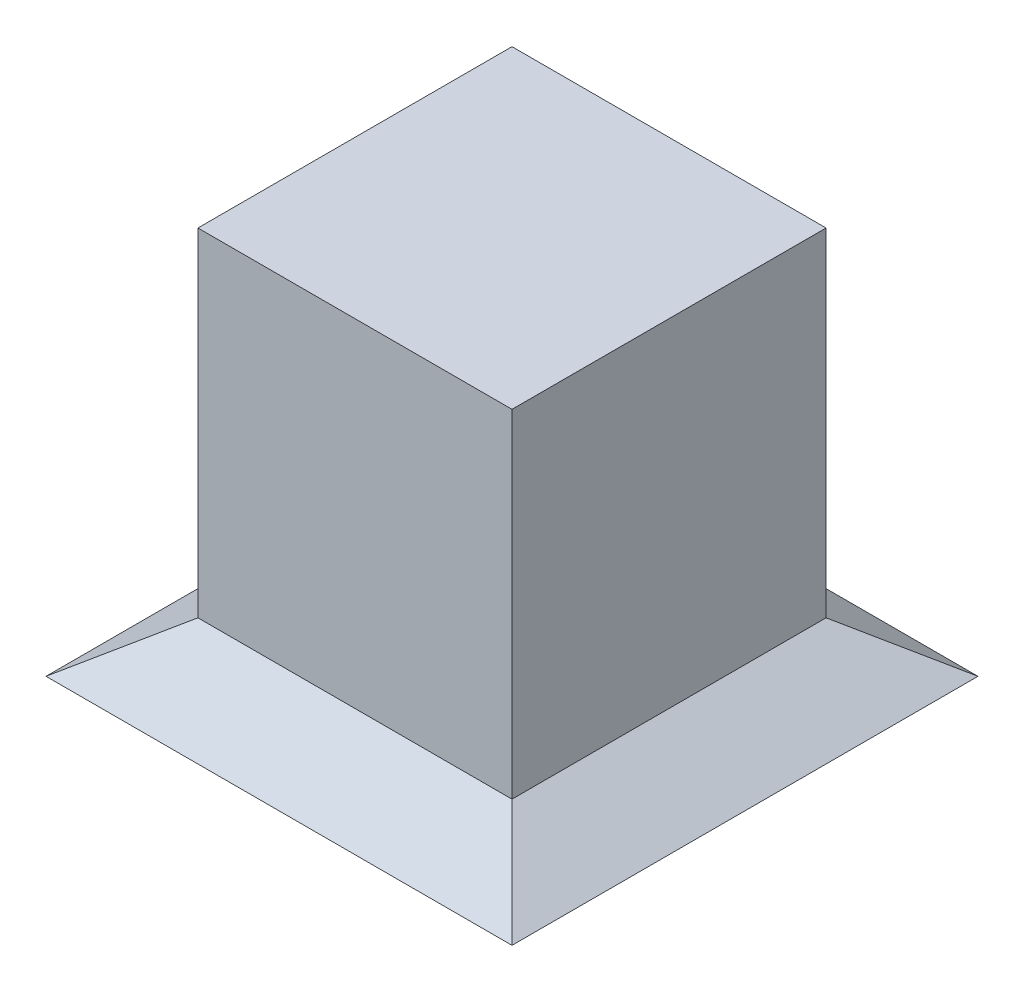
ISO-10303-21;
HEADER;
FILE_DESCRIPTION(('STEP AP214'),'2;1');
FILE_NAME('part.step','',(''),(''),'','','');
FILE_SCHEMA(('AUTOMOTIVE_DESIGN { 1 0 10303 214 1 1 1 1 }'));
ENDSEC;
DATA;
#1=APPLICATION_CONTEXT('core data for automotive mechanical design processes');
#2=APPLICATION_PROTOCOL_DEFINITION('international standard','automotive_design',2000,#1);
#3=PRODUCT_CONTEXT('',#1,'mechanical');
#4=PRODUCT('Part','Part','',(#3));
#5=PRODUCT_RELATED_PRODUCT_CATEGORY('part','',(#4));
#6=PRODUCT_DEFINITION_FORMATION('','',#4);
#7=PRODUCT_DEFINITION_CONTEXT('part definition',#1,'design');
#8=PRODUCT_DEFINITION('design','',#6,#7);
#9=PRODUCT_DEFINITION_SHAPE('','',#8);
#10=(LENGTH_UNIT() NAMED_UNIT(*) SI_UNIT(.MILLI.,.METRE.));
#11=(NAMED_UNIT(*) PLANE_ANGLE_UNIT() SI_UNIT($,.RADIAN.));
#12=(NAMED_UNIT(*) SI_UNIT($,.STERADIAN.) SOLID_ANGLE_UNIT());
#13=UNCERTAINTY_MEASURE_WITH_UNIT(LENGTH_MEASURE(1.E-05),#10,'distance_accuracy_value','');
#14=(GEOMETRIC_REPRESENTATION_CONTEXT(3) GLOBAL_UNCERTAINTY_ASSIGNED_CONTEXT((#13)) GLOBAL_UNIT_ASSIGNED_CONTEXT((#10,
#11,#12)) REPRESENTATION_CONTEXT('',''));
#15=CARTESIAN_POINT('',(0.,0.,0.));
#16=DIRECTION('',(0.,0.,1.));
#17=DIRECTION('',(1.,0.,0.));
#18=AXIS2_PLACEMENT_3D('',#15,#16,#17);
#19=CARTESIAN_POINT('',(0.,0.,0.));
#20=DIRECTION('',(0.,1.,0.));
#21=DIRECTION('',(0.,0.,1.));
#22=AXIS2_PLACEMENT_3D('',#19,#20,#21);
#23=PLANE('',#22);
#24=DIRECTION('',(0.,0.,-1.));
#25=VECTOR('',#24,1.);
#26=CARTESIAN_POINT('',(27.605551275464,0.,0.));
#27=LINE('',#26,#25);
#28=CARTESIAN_POINT('',(27.605551275464,0.,27.605551275464));
#29=VERTEX_POINT('',#28);
#30=CARTESIAN_POINT('',(27.605551275464,0.,-27.605551275464));
#31=VERTEX_POINT('',#30);
#32=EDGE_CURVE('E343',#29,#31,#27,.T.);
#33=ORIENTED_EDGE('',*,*,#32,.F.);
#34=DIRECTION('',(1.,0.,0.));
#35=VECTOR('',#34,1.);
#36=CARTESIAN_POINT('',(0.,0.,27.605551275464));
#37=LINE('',#36,#35);
#38=CARTESIAN_POINT('',(-27.605551275464,0.,27.605551275464));
#39=VERTEX_POINT('',#38);
#40=EDGE_CURVE('E340',#39,#29,#37,.T.);
#41=ORIENTED_EDGE('',*,*,#40,.F.);
#42=DIRECTION('',(0.,0.,1.));
#43=VECTOR('',#42,1.);
#44=CARTESIAN_POINT('',(-27.605551275464,0.,0.));
#45=LINE('',#44,#43);
#46=CARTESIAN_POINT('',(-27.605551275464,0.,-27.605551275464));
#47=VERTEX_POINT('',#46);
#48=EDGE_CURVE('E336',#47,#39,#45,.T.);
#49=ORIENTED_EDGE('',*,*,#48,.F.);
#50=DIRECTION('',(-1.,0.,0.));
#51=VECTOR('',#50,1.);
#52=CARTESIAN_POINT('',(0.,0.,-27.605551275464));
#53=LINE('',#52,#51);
#54=EDGE_CURVE('E339',#31,#47,#53,.T.);
#55=ORIENTED_EDGE('',*,*,#54,.F.);
#56=EDGE_LOOP('',(#33,#41,#49,#55));
#57=FACE_BOUND('',#56,.T.);
#58=DIRECTION('',(0.,0.,-1.));
#59=VECTOR('',#58,1.);
#60=CARTESIAN_POINT('',(24.,0.,-24.));
#61=LINE('',#60,#59);
#62=CARTESIAN_POINT('',(24.,0.,24.));
#63=VERTEX_POINT('',#62);
#64=CARTESIAN_POINT('',(24.,0.,-24.));
#65=VERTEX_POINT('',#64);
#66=EDGE_CURVE('E184',#63,#65,#61,.T.);
#67=ORIENTED_EDGE('',*,*,#66,.T.);
#68=DIRECTION('',(-1.,0.,0.));
#69=VECTOR('',#68,1.);
#70=CARTESIAN_POINT('',(-24.,0.,-24.));
#71=LINE('',#70,#69);
#72=CARTESIAN_POINT('',(-24.,0.,-24.));
#73=VERTEX_POINT('',#72);
#74=EDGE_CURVE('E196',#65,#73,#71,.T.);
#75=ORIENTED_EDGE('',*,*,#74,.T.);
#76=DIRECTION('',(0.,0.,1.));
#77=VECTOR('',#76,1.);
#78=CARTESIAN_POINT('',(-24.,0.,-24.));
#79=LINE('',#78,#77);
#80=CARTESIAN_POINT('',(-24.,0.,24.));
#81=VERTEX_POINT('',#80);
#82=EDGE_CURVE('E85',#73,#81,#79,.T.);
#83=ORIENTED_EDGE('',*,*,#82,.T.);
#84=DIRECTION('',(1.,0.,0.));
#85=VECTOR('',#84,1.);
#86=CARTESIAN_POINT('',(-24.,0.,24.));
#87=LINE('',#86,#85);
#88=EDGE_CURVE('E70',#81,#63,#87,.T.);
#89=ORIENTED_EDGE('',*,*,#88,.T.);
#90=EDGE_LOOP('',(#67,#75,#83,#89));
#91=FACE_BOUND('',#90,.T.);
#92=ADVANCED_FACE('F66',(#57,#91),#23,.F.);
#93=CARTESIAN_POINT('',(0.,12.7410236655988,-8.49401577706585));
#94=DIRECTION('',(0.,-0.832050294337844,0.554700196225229));
#95=DIRECTION('',(0.,-0.554700196225229,-0.832050294337843));
#96=AXIS2_PLACEMENT_3D('',#93,#94,#95);
#97=PLANE('',#96);
#98=DIRECTION('',(0.639602149066831,0.426401432711221,0.639602149066831));
#99=VECTOR('',#98,1.);
#100=CARTESIAN_POINT('',(-5.01919114099346,15.0575734229804,-5.01919114099346));
#101=LINE('',#100,#99);
#102=CARTESIAN_POINT('',(-18.605551275464,6.,-18.605551275464));
#103=VERTEX_POINT('',#102);
#104=EDGE_CURVE('E115',#47,#103,#101,.T.);
#105=ORIENTED_EDGE('',*,*,#104,.T.);
#106=DIRECTION('',(-1.,0.,0.));
#107=VECTOR('',#106,1.);
#108=CARTESIAN_POINT('',(0.,6.,-18.605551275464));
#109=LINE('',#108,#107);
#110=CARTESIAN_POINT('',(18.605551275464,6.,-18.605551275464));
#111=VERTEX_POINT('',#110);
#112=EDGE_CURVE('E12',#111,#103,#109,.T.);
#113=ORIENTED_EDGE('',*,*,#112,.F.);
#114=DIRECTION('',(-0.639602149066832,0.426401432711221,0.639602149066831));
#115=VECTOR('',#114,1.);
#116=CARTESIAN_POINT('',(5.01919114099344,15.0575734229804,-5.01919114099347));
#117=LINE('',#116,#115);
#118=EDGE_CURVE('E95',#31,#111,#117,.T.);
#119=ORIENTED_EDGE('',*,*,#118,.F.);
#120=ORIENTED_EDGE('',*,*,#54,.T.);
#121=EDGE_LOOP('',(#105,#113,#119,#120));
#122=FACE_BOUND('',#121,.T.);
#123=ADVANCED_FACE('F316',(#122),#97,.F.);
#124=CARTESIAN_POINT('',(8.49401577706584,12.7410236655988,0.));
#125=DIRECTION('',(-0.554700196225229,-0.832050294337844,0.));
#126=DIRECTION('',(0.832050294337844,-0.554700196225229,0.));
#127=AXIS2_PLACEMENT_3D('',#124,#125,#126);
#128=PLANE('',#127);
#129=ORIENTED_EDGE('',*,*,#118,.T.);
#130=DIRECTION('',(0.,0.,-1.));
#131=VECTOR('',#130,1.);
#132=CARTESIAN_POINT('',(18.605551275464,6.,0.));
#133=LINE('',#132,#131);
#134=CARTESIAN_POINT('',(18.605551275464,6.,18.605551275464));
#135=VERTEX_POINT('',#134);
#136=EDGE_CURVE('E182',#135,#111,#133,.T.);
#137=ORIENTED_EDGE('',*,*,#136,.F.);
#138=DIRECTION('',(-0.639602149066832,0.426401432711221,-0.639602149066831));
#139=VECTOR('',#138,1.);
#140=CARTESIAN_POINT('',(5.01919114099344,15.0575734229804,5.01919114099347));
#141=LINE('',#140,#139);
#142=EDGE_CURVE('E353',#29,#135,#141,.T.);
#143=ORIENTED_EDGE('',*,*,#142,.F.);
#144=ORIENTED_EDGE('',*,*,#32,.T.);
#145=EDGE_LOOP('',(#129,#137,#143,#144));
#146=FACE_BOUND('',#145,.T.);
#147=ADVANCED_FACE('F485',(#146),#128,.F.);
#148=CARTESIAN_POINT('',(-8.49401577706585,12.7410236655988,0.));
#149=DIRECTION('',(0.554700196225229,-0.832050294337843,0.));
#150=DIRECTION('',(0.832050294337843,0.554700196225229,0.));
#151=AXIS2_PLACEMENT_3D('',#148,#149,#150);
#152=PLANE('',#151);
#153=DIRECTION('',(0.639602149066831,0.426401432711221,-0.639602149066831));
#154=VECTOR('',#153,1.);
#155=CARTESIAN_POINT('',(-5.01919114099346,15.0575734229804,5.01919114099345));
#156=LINE('',#155,#154);
#157=CARTESIAN_POINT('',(-18.605551275464,6.,18.605551275464));
#158=VERTEX_POINT('',#157);
#159=EDGE_CURVE('E349',#39,#158,#156,.T.);
#160=ORIENTED_EDGE('',*,*,#159,.T.);
#161=DIRECTION('',(0.,0.,1.));
#162=VECTOR('',#161,1.);
#163=CARTESIAN_POINT('',(-18.605551275464,6.,0.));
#164=LINE('',#163,#162);
#165=EDGE_CURVE('E77',#103,#158,#164,.T.);
#166=ORIENTED_EDGE('',*,*,#165,.F.);
#167=ORIENTED_EDGE('',*,*,#104,.F.);
#168=ORIENTED_EDGE('',*,*,#48,.T.);
#169=EDGE_LOOP('',(#160,#166,#167,#168));
#170=FACE_BOUND('',#169,.T.);
#171=ADVANCED_FACE('F477',(#170),#152,.F.);
#172=CARTESIAN_POINT('',(0.,12.7410236655988,8.49401577706585));
#173=DIRECTION('',(0.,-0.832050294337844,-0.554700196225229));
#174=DIRECTION('',(0.,0.554700196225229,-0.832050294337843));
#175=AXIS2_PLACEMENT_3D('',#172,#173,#174);
#176=PLANE('',#175);
#177=ORIENTED_EDGE('',*,*,#142,.T.);
#178=DIRECTION('',(1.,0.,0.));
#179=VECTOR('',#178,1.);
#180=CARTESIAN_POINT('',(0.,6.,18.605551275464));
#181=LINE('',#180,#179);
#182=EDGE_CURVE('E360',#158,#135,#181,.T.);
#183=ORIENTED_EDGE('',*,*,#182,.F.);
#184=ORIENTED_EDGE('',*,*,#159,.F.);
#185=ORIENTED_EDGE('',*,*,#40,.T.);
#186=EDGE_LOOP('',(#177,#183,#184,#185));
#187=FACE_BOUND('',#186,.T.);
#188=ADVANCED_FACE('F68',(#187),#176,.F.);
#189=CARTESIAN_POINT('',(0.,4.,0.));
#190=DIRECTION('',(0.,1.,0.));
#191=DIRECTION('',(0.,0.,1.));
#192=AXIS2_PLACEMENT_3D('',#189,#190,#191);
#193=PLANE('',#192);
#194=DIRECTION('',(0.,0.,-1.));
#195=VECTOR('',#194,1.);
#196=CARTESIAN_POINT('',(18.,4.,-18.));
#197=LINE('',#196,#195);
#198=CARTESIAN_POINT('',(18.,4.,18.));
#199=VERTEX_POINT('',#198);
#200=CARTESIAN_POINT('',(18.,4.,-18.));
#201=VERTEX_POINT('',#200);
#202=EDGE_CURVE('E282',#199,#201,#197,.T.);
#203=ORIENTED_EDGE('',*,*,#202,.F.);
#204=DIRECTION('',(1.,0.,0.));
#205=VECTOR('',#204,1.);
#206=CARTESIAN_POINT('',(-18.,4.,18.));
#207=LINE('',#206,#205);
#208=CARTESIAN_POINT('',(-18.,4.,18.));
#209=VERTEX_POINT('',#208);
#210=EDGE_CURVE('E380',#209,#199,#207,.T.);
#211=ORIENTED_EDGE('',*,*,#210,.F.);
#212=DIRECTION('',(0.,0.,1.));
#213=VECTOR('',#212,1.);
#214=CARTESIAN_POINT('',(-18.,4.,-18.));
#215=LINE('',#214,#213);
#216=CARTESIAN_POINT('',(-18.,4.,-18.));
#217=VERTEX_POINT('',#216);
#218=EDGE_CURVE('E231',#217,#209,#215,.T.);
#219=ORIENTED_EDGE('',*,*,#218,.F.);
#220=DIRECTION('',(-1.,0.,0.));
#221=VECTOR('',#220,1.);
#222=CARTESIAN_POINT('',(-18.,4.,-18.));
#223=LINE('',#222,#221);
#224=EDGE_CURVE('E346',#201,#217,#223,.T.);
#225=ORIENTED_EDGE('',*,*,#224,.F.);
#226=EDGE_LOOP('',(#203,#211,#219,#225));
#227=FACE_BOUND('',#226,.T.);
#228=ADVANCED_FACE('F213',(#227),#193,.F.);
#229=CARTESIAN_POINT('',(0.,11.0769230769231,-7.38461538461539));
#230=DIRECTION('',(0.,-0.832050294337844,0.554700196225229));
#231=DIRECTION('',(0.,-0.554700196225229,-0.832050294337843));
#232=AXIS2_PLACEMENT_3D('',#229,#230,#231);
#233=PLANE('',#232);
#234=DIRECTION('',(0.639602149066831,0.426401432711221,0.639602149066831));
#235=VECTOR('',#234,1.);
#236=CARTESIAN_POINT('',(-24.,0.,-24.));
#237=LINE('',#236,#235);
#238=EDGE_CURVE('E426',#73,#217,#237,.T.);
#239=ORIENTED_EDGE('',*,*,#238,.F.);
#240=ORIENTED_EDGE('',*,*,#74,.F.);
#241=DIRECTION('',(-0.639602149066832,0.426401432711221,0.639602149066831));
#242=VECTOR('',#241,1.);
#243=CARTESIAN_POINT('',(24.,0.,-24.));
#244=LINE('',#243,#242);
#245=EDGE_CURVE('E124',#65,#201,#244,.T.);
#246=ORIENTED_EDGE('',*,*,#245,.T.);
#247=ORIENTED_EDGE('',*,*,#224,.T.);
#248=EDGE_LOOP('',(#239,#240,#246,#247));
#249=FACE_BOUND('',#248,.T.);
#250=ADVANCED_FACE('F202',(#249),#233,.T.);
#251=CARTESIAN_POINT('',(7.38461538461538,11.0769230769231,0.));
#252=DIRECTION('',(-0.554700196225229,-0.832050294337844,0.));
#253=DIRECTION('',(0.832050294337844,-0.554700196225229,0.));
#254=AXIS2_PLACEMENT_3D('',#251,#252,#253);
#255=PLANE('',#254);
#256=ORIENTED_EDGE('',*,*,#245,.F.);
#257=ORIENTED_EDGE('',*,*,#66,.F.);
#258=DIRECTION('',(-0.639602149066832,0.426401432711221,-0.639602149066831));
#259=VECTOR('',#258,1.);
#260=CARTESIAN_POINT('',(24.,0.,24.));
#261=LINE('',#260,#259);
#262=EDGE_CURVE('E264',#63,#199,#261,.T.);
#263=ORIENTED_EDGE('',*,*,#262,.T.);
#264=ORIENTED_EDGE('',*,*,#202,.T.);
#265=EDGE_LOOP('',(#256,#257,#263,#264));
#266=FACE_BOUND('',#265,.T.);
#267=ADVANCED_FACE('F212',(#266),#255,.T.);
#268=CARTESIAN_POINT('',(-7.38461538461539,11.0769230769231,0.));
#269=DIRECTION('',(0.554700196225229,-0.832050294337843,0.));
#270=DIRECTION('',(0.832050294337843,0.554700196225229,0.));
#271=AXIS2_PLACEMENT_3D('',#268,#269,#270);
#272=PLANE('',#271);
#273=DIRECTION('',(0.639602149066831,0.426401432711221,-0.639602149066831));
#274=VECTOR('',#273,1.);
#275=CARTESIAN_POINT('',(-24.,0.,24.));
#276=LINE('',#275,#274);
#277=EDGE_CURVE('E255',#81,#209,#276,.T.);
#278=ORIENTED_EDGE('',*,*,#277,.F.);
#279=ORIENTED_EDGE('',*,*,#82,.F.);
#280=ORIENTED_EDGE('',*,*,#238,.T.);
#281=ORIENTED_EDGE('',*,*,#218,.T.);
#282=EDGE_LOOP('',(#278,#279,#280,#281));
#283=FACE_BOUND('',#282,.T.);
#284=ADVANCED_FACE('F237',(#283),#272,.T.);
#285=CARTESIAN_POINT('',(0.,11.0769230769231,7.38461538461539));
#286=DIRECTION('',(0.,-0.832050294337844,-0.554700196225229));
#287=DIRECTION('',(0.,0.554700196225229,-0.832050294337843));
#288=AXIS2_PLACEMENT_3D('',#285,#286,#287);
#289=PLANE('',#288);
#290=ORIENTED_EDGE('',*,*,#262,.F.);
#291=ORIENTED_EDGE('',*,*,#88,.F.);
#292=ORIENTED_EDGE('',*,*,#277,.T.);
#293=ORIENTED_EDGE('',*,*,#210,.T.);
#294=EDGE_LOOP('',(#290,#291,#292,#293));
#295=FACE_BOUND('',#294,.T.);
#296=ADVANCED_FACE('F246',(#295),#289,.T.);
#297=CARTESIAN_POINT('',(18.605551275464,46.,-18.605551275464));
#298=DIRECTION('',(-1.,0.,0.));
#299=DIRECTION('',(0.,0.,1.));
#300=AXIS2_PLACEMENT_3D('',#297,#298,#299);
#301=PLANE('',#300);
#302=ORIENTED_EDGE('',*,*,#136,.T.);
#303=DIRECTION('',(0.,-1.,0.));
#304=VECTOR('',#303,1.);
#305=CARTESIAN_POINT('',(18.605551275464,46.,-18.605551275464));
#306=LINE('',#305,#304);
#307=CARTESIAN_POINT('',(18.605551275464,46.,-18.605551275464));
#308=VERTEX_POINT('',#307);
#309=EDGE_CURVE('E162',#308,#111,#306,.T.);
#310=ORIENTED_EDGE('',*,*,#309,.F.);
#311=DIRECTION('',(0.,0.,-1.));
#312=VECTOR('',#311,1.);
#313=CARTESIAN_POINT('',(18.605551275464,46.,-18.605551275464));
#314=LINE('',#313,#312);
#315=CARTESIAN_POINT('',(18.605551275464,46.,18.605551275464));
#316=VERTEX_POINT('',#315);
#317=EDGE_CURVE('E170',#316,#308,#314,.T.);
#318=ORIENTED_EDGE('',*,*,#317,.F.);
#319=DIRECTION('',(0.,-1.,0.));
#320=VECTOR('',#319,1.);
#321=CARTESIAN_POINT('',(18.605551275464,46.,18.605551275464));
#322=LINE('',#321,#320);
#323=EDGE_CURVE('E622',#316,#135,#322,.T.);
#324=ORIENTED_EDGE('',*,*,#323,.T.);
#325=EDGE_LOOP('',(#302,#310,#318,#324));
#326=FACE_BOUND('',#325,.T.);
#327=ADVANCED_FACE('F181',(#326),#301,.F.);
#328=CARTESIAN_POINT('',(-18.605551275464,46.,-18.605551275464));
#329=DIRECTION('',(0.,0.,1.));
#330=DIRECTION('',(1.,0.,0.));
#331=AXIS2_PLACEMENT_3D('',#328,#329,#330);
#332=PLANE('',#331);
#333=ORIENTED_EDGE('',*,*,#112,.T.);
#334=DIRECTION('',(0.,-1.,0.));
#335=VECTOR('',#334,1.);
#336=CARTESIAN_POINT('',(-18.605551275464,46.,-18.605551275464));
#337=LINE('',#336,#335);
#338=CARTESIAN_POINT('',(-18.605551275464,46.,-18.605551275464));
#339=VERTEX_POINT('',#338);
#340=EDGE_CURVE('E165',#339,#103,#337,.T.);
#341=ORIENTED_EDGE('',*,*,#340,.F.);
#342=DIRECTION('',(-1.,0.,0.));
#343=VECTOR('',#342,1.);
#344=CARTESIAN_POINT('',(-18.605551275464,46.,-18.605551275464));
#345=LINE('',#344,#343);
#346=EDGE_CURVE('E158',#308,#339,#345,.T.);
#347=ORIENTED_EDGE('',*,*,#346,.F.);
#348=ORIENTED_EDGE('',*,*,#309,.T.);
#349=EDGE_LOOP('',(#333,#341,#347,#348));
#350=FACE_BOUND('',#349,.T.);
#351=ADVANCED_FACE('F160',(#350),#332,.F.);
#352=CARTESIAN_POINT('',(-18.605551275464,46.,-18.605551275464));
#353=DIRECTION('',(1.,0.,0.));
#354=DIRECTION('',(0.,0.,-1.));
#355=AXIS2_PLACEMENT_3D('',#352,#353,#354);
#356=PLANE('',#355);
#357=ORIENTED_EDGE('',*,*,#165,.T.);
#358=DIRECTION('',(0.,-1.,0.));
#359=VECTOR('',#358,1.);
#360=CARTESIAN_POINT('',(-18.605551275464,46.,18.605551275464));
#361=LINE('',#360,#359);
#362=CARTESIAN_POINT('',(-18.605551275464,46.,18.605551275464));
#363=VERTEX_POINT('',#362);
#364=EDGE_CURVE('E190',#363,#158,#361,.T.);
#365=ORIENTED_EDGE('',*,*,#364,.F.);
#366=DIRECTION('',(0.,0.,1.));
#367=VECTOR('',#366,1.);
#368=CARTESIAN_POINT('',(-18.605551275464,46.,-18.605551275464));
#369=LINE('',#368,#367);
#370=EDGE_CURVE('E169',#339,#363,#369,.T.);
#371=ORIENTED_EDGE('',*,*,#370,.F.);
#372=ORIENTED_EDGE('',*,*,#340,.T.);
#373=EDGE_LOOP('',(#357,#365,#371,#372));
#374=FACE_BOUND('',#373,.T.);
#375=ADVANCED_FACE('F440',(#374),#356,.F.);
#376=CARTESIAN_POINT('',(-18.605551275464,46.,18.605551275464));
#377=DIRECTION('',(0.,0.,-1.));
#378=DIRECTION('',(-1.,0.,0.));
#379=AXIS2_PLACEMENT_3D('',#376,#377,#378);
#380=PLANE('',#379);
#381=ORIENTED_EDGE('',*,*,#182,.T.);
#382=ORIENTED_EDGE('',*,*,#323,.F.);
#383=DIRECTION('',(1.,0.,0.));
#384=VECTOR('',#383,1.);
#385=CARTESIAN_POINT('',(-18.605551275464,46.,18.605551275464));
#386=LINE('',#385,#384);
#387=EDGE_CURVE('E175',#363,#316,#386,.T.);
#388=ORIENTED_EDGE('',*,*,#387,.F.);
#389=ORIENTED_EDGE('',*,*,#364,.T.);
#390=EDGE_LOOP('',(#381,#382,#388,#389));
#391=FACE_BOUND('',#390,.T.);
#392=ADVANCED_FACE('F443',(#391),#380,.F.);
#393=CARTESIAN_POINT('',(0.,46.,0.));
#394=DIRECTION('',(0.,1.,0.));
#395=DIRECTION('',(0.,0.,1.));
#396=AXIS2_PLACEMENT_3D('',#393,#394,#395);
#397=PLANE('',#396);
#398=ORIENTED_EDGE('',*,*,#317,.T.);
#399=ORIENTED_EDGE('',*,*,#346,.T.);
#400=ORIENTED_EDGE('',*,*,#370,.T.);
#401=ORIENTED_EDGE('',*,*,#387,.T.);
#402=EDGE_LOOP('',(#398,#399,#400,#401));
#403=FACE_BOUND('',#402,.T.);
#404=ADVANCED_FACE('F173',(#403),#397,.T.);
#405=CLOSED_SHELL('',(#92,#123,#147,#171,#188,#228,#250,#267,#284,#296,#327,#351,#375,#392,#404));
#406=MANIFOLD_SOLID_BREP('B2',#405);
#407=ADVANCED_BREP_SHAPE_REPRESENTATION('',(#18,#406),#14);
#408=SHAPE_DEFINITION_REPRESENTATION(#9,#407);
ENDSEC;
END-ISO-10303-21;
